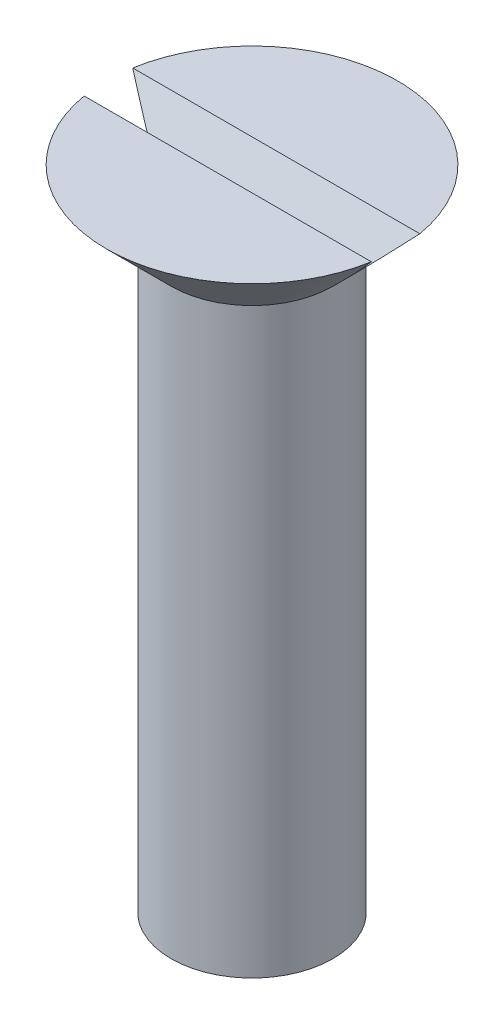
ISO-10303-21;
HEADER;
FILE_DESCRIPTION(('STEP AP214'),'2;1');
FILE_NAME('part.step','',(''),(''),'','','');
FILE_SCHEMA(('AUTOMOTIVE_DESIGN { 1 0 10303 214 1 1 1 1 }'));
ENDSEC;
DATA;
#1=APPLICATION_CONTEXT('core data for automotive mechanical design processes');
#2=APPLICATION_PROTOCOL_DEFINITION('international standard','automotive_design',2000,#1);
#3=PRODUCT_CONTEXT('',#1,'mechanical');
#4=PRODUCT('Part','Part','',(#3));
#5=PRODUCT_RELATED_PRODUCT_CATEGORY('part','',(#4));
#6=PRODUCT_DEFINITION_FORMATION('','',#4);
#7=PRODUCT_DEFINITION_CONTEXT('part definition',#1,'design');
#8=PRODUCT_DEFINITION('design','',#6,#7);
#9=PRODUCT_DEFINITION_SHAPE('','',#8);
#10=(LENGTH_UNIT() NAMED_UNIT(*) SI_UNIT(.MILLI.,.METRE.));
#11=(NAMED_UNIT(*) PLANE_ANGLE_UNIT() SI_UNIT($,.RADIAN.));
#12=(NAMED_UNIT(*) SI_UNIT($,.STERADIAN.) SOLID_ANGLE_UNIT());
#13=UNCERTAINTY_MEASURE_WITH_UNIT(LENGTH_MEASURE(1.E-05),#10,'distance_accuracy_value','');
#14=(GEOMETRIC_REPRESENTATION_CONTEXT(3) GLOBAL_UNCERTAINTY_ASSIGNED_CONTEXT((#13)) GLOBAL_UNIT_ASSIGNED_CONTEXT((#10,
#11,#12)) REPRESENTATION_CONTEXT('',''));
#15=CARTESIAN_POINT('',(0.,0.,0.));
#16=DIRECTION('',(0.,0.,1.));
#17=DIRECTION('',(1.,0.,0.));
#18=AXIS2_PLACEMENT_3D('',#15,#16,#17);
#19=CARTESIAN_POINT('',(0.,35.116265060241,0.));
#20=DIRECTION('',(0.,-1.,0.));
#21=DIRECTION('',(0.,0.,-1.));
#22=AXIS2_PLACEMENT_3D('',#19,#20,#21);
#23=PLANE('',#22);
#24=CARTESIAN_POINT('',(0.,35.116265060241,0.));
#25=DIRECTION('',(0.,1.,0.));
#26=DIRECTION('',(0.,0.,1.));
#27=AXIS2_PLACEMENT_3D('',#24,#25,#26);
#28=CIRCLE('',#27,4.5);
#29=CARTESIAN_POINT('',(4.43705983732471,35.116265060241,-0.75));
#30=VERTEX_POINT('',#29);
#31=CARTESIAN_POINT('',(-4.43705983732471,35.116265060241,-0.75));
#32=VERTEX_POINT('',#31);
#33=EDGE_CURVE('E81',#30,#32,#28,.T.);
#34=ORIENTED_EDGE('',*,*,#33,.T.);
#35=DIRECTION('',(1.,0.,0.));
#36=VECTOR('',#35,1.);
#37=CARTESIAN_POINT('',(-5.,35.116265060241,-0.75));
#38=LINE('',#37,#36);
#39=EDGE_CURVE('E126',#32,#30,#38,.T.);
#40=ORIENTED_EDGE('',*,*,#39,.T.);
#41=EDGE_LOOP('',(#34,#40));
#42=FACE_BOUND('',#41,.T.);
#43=ADVANCED_FACE('F31',(#42),#23,.F.);
#44=CARTESIAN_POINT('',(-4.43705983732471,35.116265060241,0.75));
#45=VERTEX_POINT('',#44);
#46=CARTESIAN_POINT('',(4.43705983732471,35.116265060241,0.75));
#47=VERTEX_POINT('',#46);
#48=EDGE_CURVE('E76',#45,#47,#28,.T.);
#49=ORIENTED_EDGE('',*,*,#48,.T.);
#50=DIRECTION('',(1.,0.,0.));
#51=VECTOR('',#50,1.);
#52=CARTESIAN_POINT('',(-5.,35.116265060241,0.75));
#53=LINE('',#52,#51);
#54=EDGE_CURVE('E50',#45,#47,#53,.T.);
#55=ORIENTED_EDGE('',*,*,#54,.F.);
#56=EDGE_LOOP('',(#49,#55));
#57=FACE_BOUND('',#56,.T.);
#58=ADVANCED_FACE('F33',(#57),#23,.F.);
#59=CARTESIAN_POINT('',(0.,33.116265060241,0.));
#60=DIRECTION('',(0.,1.,0.));
#61=DIRECTION('',(0.,0.,1.));
#62=AXIS2_PLACEMENT_3D('',#59,#60,#61);
#63=CONICAL_SURFACE('',#62,2.5,0.785398163397447);
#64=CARTESIAN_POINT('',(-4.43724577074563,35.116465060241,0.750099999999999));
#65=CARTESIAN_POINT('',(-4.31952513361203,34.9898576788931,0.686796309326077));
#66=CARTESIAN_POINT('',(-4.20145882542963,34.8635055040406,0.623620221899802));
#67=CARTESIAN_POINT('',(-3.9644074604967,34.6115094845425,0.49762221215075));
#68=CARTESIAN_POINT('',(-3.84542247494455,34.485865586285,0.434800263022004));
#69=CARTESIAN_POINT('',(-3.60628349326373,34.2354594583706,0.309597199064812));
#70=CARTESIAN_POINT('',(-3.4861294498077,34.110697264764,0.247216102261504));
#71=CARTESIAN_POINT('',(-3.24424526803894,33.8623853826412,0.123060161200092));
#72=CARTESIAN_POINT('',(-3.12251500805854,33.7388357890348,0.0612853643969296));
#73=CARTESIAN_POINT('',(-2.99979999833322,33.616065060241,-0.000100000000000365));
#74=B_SPLINE_CURVE_WITH_KNOTS('',3,(#64,#65,#66,#67,#68,#69,#70,#71,#72,#73),.UNSPECIFIED.,.F.,
.F.,(4,2,2,2,4),(0.,0.552319008622968,1.10459563327267,1.65689470972147,2.20923667515644),.UNSPECIFIED.);
#75=CARTESIAN_POINT('',(-3.,33.616265060241,0.));
#76=VERTEX_POINT('',#75);
#77=EDGE_CURVE('E43',#45,#76,#74,.T.);
#78=ORIENTED_EDGE('',*,*,#77,.T.);
#79=CARTESIAN_POINT('',(-2.99979999833322,33.616065060241,9.99999999991229E-05));
#80=CARTESIAN_POINT('',(-3.12251500805854,33.7388357890348,-0.0612853643969309));
#81=CARTESIAN_POINT('',(-3.24424526803894,33.8623853826412,-0.123060161200093));
#82=CARTESIAN_POINT('',(-3.4861294498077,34.110697264764,-0.247216102261505));
#83=CARTESIAN_POINT('',(-3.60628349326373,34.2354594583706,-0.309597199064812));
#84=CARTESIAN_POINT('',(-3.84542247494455,34.485865586285,-0.434800263022004));
#85=CARTESIAN_POINT('',(-3.9644074604967,34.6115094845425,-0.497622212150751));
#86=CARTESIAN_POINT('',(-4.20145882542963,34.8635055040406,-0.623620221899803));
#87=CARTESIAN_POINT('',(-4.31952513361203,34.9898576788931,-0.686796309326077));
#88=CARTESIAN_POINT('',(-4.43724577074563,35.116465060241,-0.750099999999999));
#89=B_SPLINE_CURVE_WITH_KNOTS('',3,(#79,#80,#81,#82,#83,#84,#85,#86,#87,#88),.UNSPECIFIED.,.F.,
.F.,(4,2,2,2,4),(0.,0.552341965434966,1.10464104188376,1.65691766653347,2.20923667515643),.UNSPECIFIED.);
#90=EDGE_CURVE('E11',#76,#32,#89,.T.);
#91=ORIENTED_EDGE('',*,*,#90,.T.);
#92=ORIENTED_EDGE('',*,*,#33,.F.);
#93=CARTESIAN_POINT('',(4.43724577074563,35.116465060241,-0.7501));
#94=CARTESIAN_POINT('',(4.31952513361203,34.9898576788931,-0.686796309326077));
#95=CARTESIAN_POINT('',(4.20145882542963,34.8635055040406,-0.623620221899803));
#96=CARTESIAN_POINT('',(3.9644074604967,34.6115094845425,-0.497622212150751));
#97=CARTESIAN_POINT('',(3.84542247494455,34.485865586285,-0.434800263022005));
#98=CARTESIAN_POINT('',(3.60628349326373,34.2354594583706,-0.309597199064812));
#99=CARTESIAN_POINT('',(3.4861294498077,34.110697264764,-0.247216102261505));
#100=CARTESIAN_POINT('',(3.24424526803894,33.8623853826412,-0.123060161200093));
#101=CARTESIAN_POINT('',(3.12251500805854,33.7388357890348,-0.0612853643969304));
#102=CARTESIAN_POINT('',(2.99979999833322,33.616065060241,9.99999999996786E-05));
#103=B_SPLINE_CURVE_WITH_KNOTS('',3,(#93,#94,#95,#96,#97,#98,#99,#100,#101,#102),.UNSPECIFIED.,
.F.,.F.,(4,2,2,2,4),(0.,0.552319008622968,1.10459563327267,1.65689470972147,2.20923667515644),.UNSPECIFIED.);
#104=CARTESIAN_POINT('',(3.,33.616265060241,0.));
#105=VERTEX_POINT('',#104);
#106=EDGE_CURVE('E58',#30,#105,#103,.T.);
#107=ORIENTED_EDGE('',*,*,#106,.T.);
#108=CARTESIAN_POINT('',(2.99979999833322,33.616065060241,-9.99999999998933E-05));
#109=CARTESIAN_POINT('',(3.12251500805854,33.7388357890348,0.06128536439693));
#110=CARTESIAN_POINT('',(3.24424526803894,33.8623853826412,0.123060161200092));
#111=CARTESIAN_POINT('',(3.4861294498077,34.110697264764,0.247216102261504));
#112=CARTESIAN_POINT('',(3.60628349326373,34.2354594583706,0.309597199064812));
#113=CARTESIAN_POINT('',(3.84542247494455,34.485865586285,0.434800263022004));
#114=CARTESIAN_POINT('',(3.9644074604967,34.6115094845425,0.49762221215075));
#115=CARTESIAN_POINT('',(4.20145882542963,34.8635055040406,0.623620221899802));
#116=CARTESIAN_POINT('',(4.31952513361203,34.9898576788931,0.686796309326076));
#117=CARTESIAN_POINT('',(4.43724577074563,35.116465060241,0.750099999999999));
#118=B_SPLINE_CURVE_WITH_KNOTS('',3,(#108,#109,#110,#111,#112,#113,#114,#115,#116,#117),
.UNSPECIFIED.,.F.,.F.,(4,2,2,2,4),(0.,0.552341965434966,1.10464104188376,1.65691766653347,
2.20923667515644),.UNSPECIFIED.);
#119=EDGE_CURVE('E80',#105,#47,#118,.T.);
#120=ORIENTED_EDGE('',*,*,#119,.T.);
#121=ORIENTED_EDGE('',*,*,#48,.F.);
#122=EDGE_LOOP('',(#78,#91,#92,#107,#120,#121));
#123=FACE_BOUND('',#122,.T.);
#124=CARTESIAN_POINT('',(0.,33.116265060241,0.));
#125=DIRECTION('',(0.,1.,0.));
#126=DIRECTION('',(0.,0.,1.));
#127=AXIS2_PLACEMENT_3D('',#124,#125,#126);
#128=CIRCLE('',#127,2.5);
#129=CARTESIAN_POINT('',(0.,33.116265060241,2.5));
#130=VERTEX_POINT('',#129);
#131=EDGE_CURVE('E82',#130,#130,#128,.T.);
#132=ORIENTED_EDGE('',*,*,#131,.T.);
#133=EDGE_LOOP('',(#132));
#134=FACE_BOUND('',#133,.T.);
#135=ADVANCED_FACE('F78',(#123,#134),#63,.T.);
#136=CARTESIAN_POINT('',(0.,45.5210843373494,0.));
#137=DIRECTION('',(0.,1.,0.));
#138=DIRECTION('',(0.,0.,1.));
#139=AXIS2_PLACEMENT_3D('',#136,#137,#138);
#140=CYLINDRICAL_SURFACE('',#139,2.5);
#141=ORIENTED_EDGE('',*,*,#131,.F.);
#142=EDGE_LOOP('',(#141));
#143=FACE_BOUND('',#142,.T.);
#144=CARTESIAN_POINT('',(0.,15.1162650602409,0.));
#145=DIRECTION('',(0.,1.,0.));
#146=DIRECTION('',(0.,0.,1.));
#147=AXIS2_PLACEMENT_3D('',#144,#145,#146);
#148=CIRCLE('',#147,2.5);
#149=CARTESIAN_POINT('',(0.,15.1162650602409,2.5));
#150=VERTEX_POINT('',#149);
#151=EDGE_CURVE('E86',#150,#150,#148,.T.);
#152=ORIENTED_EDGE('',*,*,#151,.T.);
#153=EDGE_LOOP('',(#152));
#154=FACE_BOUND('',#153,.T.);
#155=ADVANCED_FACE('F111',(#143,#154),#140,.T.);
#156=CARTESIAN_POINT('',(2.5,15.1162650602409,0.));
#157=DIRECTION('',(0.,1.,0.));
#158=DIRECTION('',(0.,0.,1.));
#159=AXIS2_PLACEMENT_3D('',#156,#157,#158);
#160=PLANE('',#159);
#161=ORIENTED_EDGE('',*,*,#151,.F.);
#162=EDGE_LOOP('',(#161));
#163=FACE_BOUND('',#162,.T.);
#164=ADVANCED_FACE('F105',(#163),#160,.F.);
#165=CARTESIAN_POINT('',(-5.,33.616265060241,0.));
#166=DIRECTION('',(0.,-0.447213595499958,-0.894427190999916));
#167=DIRECTION('',(0.,0.894427190999916,-0.447213595499958));
#168=AXIS2_PLACEMENT_3D('',#165,#166,#167);
#169=PLANE('',#168);
#170=ORIENTED_EDGE('',*,*,#39,.F.);
#171=ORIENTED_EDGE('',*,*,#90,.F.);
#172=DIRECTION('',(1.,0.,0.));
#173=VECTOR('',#172,1.);
#174=CARTESIAN_POINT('',(-5.,33.616265060241,0.));
#175=LINE('',#174,#173);
#176=EDGE_CURVE('E71',#76,#105,#175,.T.);
#177=ORIENTED_EDGE('',*,*,#176,.T.);
#178=ORIENTED_EDGE('',*,*,#106,.F.);
#179=EDGE_LOOP('',(#170,#171,#177,#178));
#180=FACE_BOUND('',#179,.T.);
#181=ADVANCED_FACE('F103',(#180),#169,.F.);
#182=CARTESIAN_POINT('',(-5.,35.116265060241,0.75));
#183=DIRECTION('',(0.,-0.447213595499958,0.894427190999916));
#184=DIRECTION('',(0.,-0.894427190999916,-0.447213595499958));
#185=AXIS2_PLACEMENT_3D('',#182,#183,#184);
#186=PLANE('',#185);
#187=ORIENTED_EDGE('',*,*,#54,.T.);
#188=ORIENTED_EDGE('',*,*,#119,.F.);
#189=ORIENTED_EDGE('',*,*,#176,.F.);
#190=ORIENTED_EDGE('',*,*,#77,.F.);
#191=EDGE_LOOP('',(#187,#188,#189,#190));
#192=FACE_BOUND('',#191,.T.);
#193=ADVANCED_FACE('F70',(#192),#186,.F.);
#194=CLOSED_SHELL('',(#43,#58,#135,#155,#164,#181,#193));
#195=MANIFOLD_SOLID_BREP('B2',#194);
#196=ADVANCED_BREP_SHAPE_REPRESENTATION('',(#18,#195),#14);
#197=SHAPE_DEFINITION_REPRESENTATION(#9,#196);
ENDSEC;
END-ISO-10303-21;
